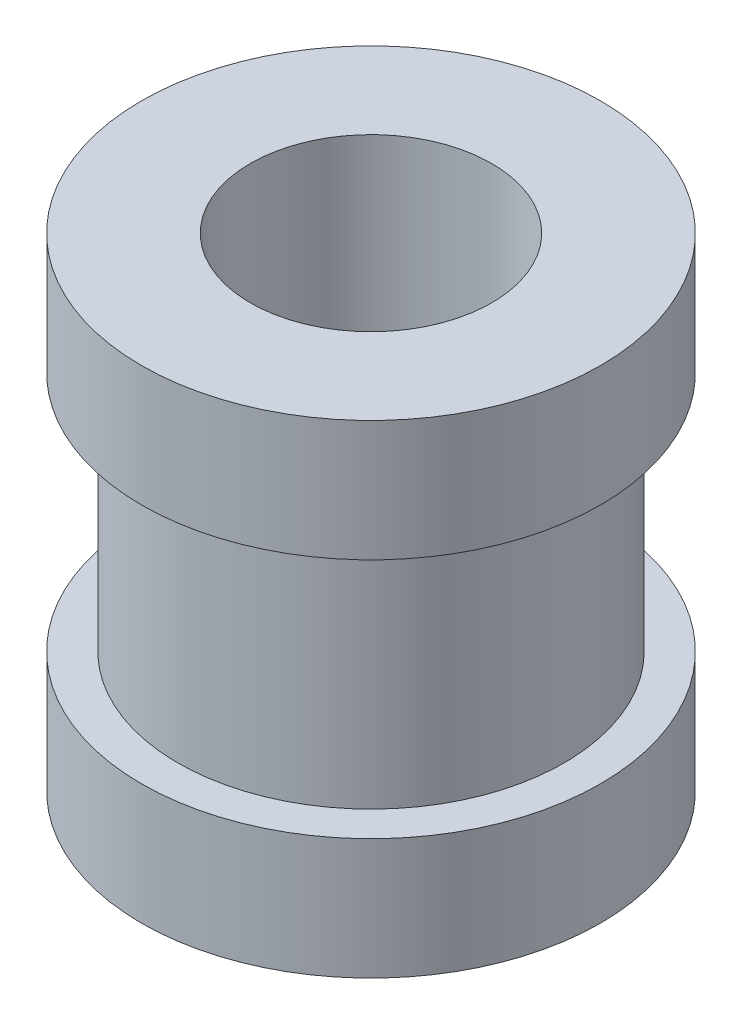
ISO-10303-21;
HEADER;
FILE_DESCRIPTION(('STEP AP214'),'2;1');
FILE_NAME('part.step','',(''),(''),'','','');
FILE_SCHEMA(('AUTOMOTIVE_DESIGN { 1 0 10303 214 1 1 1 1 }'));
ENDSEC;
DATA;
#1=APPLICATION_CONTEXT('core data for automotive mechanical design processes');
#2=APPLICATION_PROTOCOL_DEFINITION('international standard','automotive_design',2000,#1);
#3=PRODUCT_CONTEXT('',#1,'mechanical');
#4=PRODUCT('Part','Part','',(#3));
#5=PRODUCT_RELATED_PRODUCT_CATEGORY('part','',(#4));
#6=PRODUCT_DEFINITION_FORMATION('','',#4);
#7=PRODUCT_DEFINITION_CONTEXT('part definition',#1,'design');
#8=PRODUCT_DEFINITION('design','',#6,#7);
#9=PRODUCT_DEFINITION_SHAPE('','',#8);
#10=(LENGTH_UNIT() NAMED_UNIT(*) SI_UNIT(.MILLI.,.METRE.));
#11=(NAMED_UNIT(*) PLANE_ANGLE_UNIT() SI_UNIT($,.RADIAN.));
#12=(NAMED_UNIT(*) SI_UNIT($,.STERADIAN.) SOLID_ANGLE_UNIT());
#13=UNCERTAINTY_MEASURE_WITH_UNIT(LENGTH_MEASURE(1.E-05),#10,'distance_accuracy_value','');
#14=(GEOMETRIC_REPRESENTATION_CONTEXT(3) GLOBAL_UNCERTAINTY_ASSIGNED_CONTEXT((#13)) GLOBAL_UNIT_ASSIGNED_CONTEXT((#10,
#11,#12)) REPRESENTATION_CONTEXT('',''));
#15=CARTESIAN_POINT('',(0.,0.,0.));
#16=DIRECTION('',(0.,0.,1.));
#17=DIRECTION('',(1.,0.,0.));
#18=AXIS2_PLACEMENT_3D('',#15,#16,#17);
#19=CARTESIAN_POINT('',(21.2956759474531,70.9670130886636,143.228955153829));
#20=DIRECTION('',(0.,1.,0.));
#21=DIRECTION('',(-1.,0.,0.));
#22=AXIS2_PLACEMENT_3D('',#19,#20,#21);
#23=CYLINDRICAL_SURFACE('',#22,1.6);
#24=CARTESIAN_POINT('',(21.2956759474531,71.9670130886636,143.228955153829));
#25=DIRECTION('',(0.,1.,0.));
#26=DIRECTION('',(-1.,0.,0.));
#27=AXIS2_PLACEMENT_3D('',#24,#25,#26);
#28=CIRCLE('',#27,1.6);
#29=CARTESIAN_POINT('',(19.6956759474531,71.9670130886636,143.228955153829));
#30=VERTEX_POINT('',#29);
#31=EDGE_CURVE('E18',#30,#30,#28,.T.);
#32=ORIENTED_EDGE('',*,*,#31,.F.);
#33=EDGE_LOOP('',(#32));
#34=FACE_BOUND('',#33,.T.);
#35=CARTESIAN_POINT('',(21.2956759474531,69.9670130886636,143.228955153829));
#36=DIRECTION('',(0.,1.,0.));
#37=DIRECTION('',(-1.,0.,0.));
#38=AXIS2_PLACEMENT_3D('',#35,#36,#37);
#39=CIRCLE('',#38,1.6);
#40=CARTESIAN_POINT('',(19.6956759474531,69.9670130886636,143.228955153829));
#41=VERTEX_POINT('',#40);
#42=EDGE_CURVE('E40',#41,#41,#39,.F.);
#43=ORIENTED_EDGE('',*,*,#42,.F.);
#44=EDGE_LOOP('',(#43));
#45=FACE_BOUND('',#44,.T.);
#46=ADVANCED_FACE('F15',(#34,#45),#23,.T.);
#47=CARTESIAN_POINT('',(23.4956759474531,71.9670130886636,143.228955153829));
#48=DIRECTION('',(0.,-1.,0.));
#49=DIRECTION('',(1.,0.,0.));
#50=AXIS2_PLACEMENT_3D('',#47,#48,#49);
#51=PLANE('',#50);
#52=ORIENTED_EDGE('',*,*,#31,.T.);
#53=EDGE_LOOP('',(#52));
#54=FACE_BOUND('',#53,.T.);
#55=CARTESIAN_POINT('',(21.2956759474531,71.9670130886636,143.228955153829));
#56=DIRECTION('',(0.,1.,0.));
#57=DIRECTION('',(-1.,0.,0.));
#58=AXIS2_PLACEMENT_3D('',#55,#56,#57);
#59=CIRCLE('',#58,1.90000000000001);
#60=CARTESIAN_POINT('',(19.3956759474531,71.9670130886636,143.228955153829));
#61=VERTEX_POINT('',#60);
#62=EDGE_CURVE('E38',#61,#61,#59,.T.);
#63=ORIENTED_EDGE('',*,*,#62,.F.);
#64=EDGE_LOOP('',(#63));
#65=FACE_BOUND('',#64,.T.);
#66=ADVANCED_FACE('F47',(#54,#65),#51,.T.);
#67=CARTESIAN_POINT('',(23.4956759474531,69.9670130886636,143.228955153829));
#68=DIRECTION('',(0.,1.,0.));
#69=DIRECTION('',(-1.,0.,0.));
#70=AXIS2_PLACEMENT_3D('',#67,#68,#69);
#71=PLANE('',#70);
#72=ORIENTED_EDGE('',*,*,#42,.T.);
#73=EDGE_LOOP('',(#72));
#74=FACE_BOUND('',#73,.T.);
#75=CARTESIAN_POINT('',(21.2956759474531,69.9670130886636,143.228955153829));
#76=DIRECTION('',(0.,1.,0.));
#77=DIRECTION('',(-1.,0.,0.));
#78=AXIS2_PLACEMENT_3D('',#75,#76,#77);
#79=CIRCLE('',#78,1.90000000000001);
#80=CARTESIAN_POINT('',(19.3956759474531,69.9670130886636,143.228955153829));
#81=VERTEX_POINT('',#80);
#82=EDGE_CURVE('E35',#81,#81,#79,.F.);
#83=ORIENTED_EDGE('',*,*,#82,.F.);
#84=EDGE_LOOP('',(#83));
#85=FACE_BOUND('',#84,.T.);
#86=ADVANCED_FACE('F56',(#74,#85),#71,.T.);
#87=CARTESIAN_POINT('',(21.2956759474531,68.9670130886636,143.228955153829));
#88=DIRECTION('',(0.,1.,0.));
#89=DIRECTION('',(-1.,0.,0.));
#90=AXIS2_PLACEMENT_3D('',#87,#88,#89);
#91=CYLINDRICAL_SURFACE('',#90,1.90000000000001);
#92=ORIENTED_EDGE('',*,*,#62,.T.);
#93=EDGE_LOOP('',(#92));
#94=FACE_BOUND('',#93,.T.);
#95=CARTESIAN_POINT('',(21.2956759474531,72.9670130886636,143.228955153829));
#96=DIRECTION('',(0.,1.,0.));
#97=DIRECTION('',(-1.,0.,0.));
#98=AXIS2_PLACEMENT_3D('',#95,#96,#97);
#99=CIRCLE('',#98,1.90000000000001);
#100=CARTESIAN_POINT('',(19.3956759474531,72.9670130886636,143.228955153829));
#101=VERTEX_POINT('',#100);
#102=EDGE_CURVE('E32',#101,#101,#99,.F.);
#103=ORIENTED_EDGE('',*,*,#102,.T.);
#104=EDGE_LOOP('',(#103));
#105=FACE_BOUND('',#104,.T.);
#106=ADVANCED_FACE('F76',(#94,#105),#91,.T.);
#107=CARTESIAN_POINT('',(21.2956759474531,68.9670130886636,143.228955153829));
#108=DIRECTION('',(0.,1.,0.));
#109=DIRECTION('',(-1.,0.,0.));
#110=AXIS2_PLACEMENT_3D('',#107,#108,#109);
#111=CYLINDRICAL_SURFACE('',#110,1.90000000000001);
#112=ORIENTED_EDGE('',*,*,#82,.T.);
#113=EDGE_LOOP('',(#112));
#114=FACE_BOUND('',#113,.T.);
#115=CARTESIAN_POINT('',(21.2956759474531,68.9670130886636,143.228955153829));
#116=DIRECTION('',(0.,1.,0.));
#117=DIRECTION('',(-1.,0.,0.));
#118=AXIS2_PLACEMENT_3D('',#115,#116,#117);
#119=CIRCLE('',#118,1.90000000000001);
#120=CARTESIAN_POINT('',(19.3956759474531,68.9670130886636,143.228955153829));
#121=VERTEX_POINT('',#120);
#122=EDGE_CURVE('E27',#121,#121,#119,.F.);
#123=ORIENTED_EDGE('',*,*,#122,.F.);
#124=EDGE_LOOP('',(#123));
#125=FACE_BOUND('',#124,.T.);
#126=ADVANCED_FACE('F72',(#114,#125),#111,.T.);
#127=CARTESIAN_POINT('',(21.2956759474531,72.9670130886636,143.228955153829));
#128=DIRECTION('',(0.,-1.,0.));
#129=DIRECTION('',(1.,0.,0.));
#130=AXIS2_PLACEMENT_3D('',#127,#128,#129);
#131=PLANE('',#130);
#132=ORIENTED_EDGE('',*,*,#102,.F.);
#133=EDGE_LOOP('',(#132));
#134=FACE_BOUND('',#133,.T.);
#135=CARTESIAN_POINT('',(21.2956759474531,72.9670130886636,143.228955153829));
#136=DIRECTION('',(0.,1.,0.));
#137=DIRECTION('',(-1.,0.,0.));
#138=AXIS2_PLACEMENT_3D('',#135,#136,#137);
#139=CIRCLE('',#138,1.);
#140=CARTESIAN_POINT('',(20.2956759474531,72.9670130886636,143.228955153829));
#141=VERTEX_POINT('',#140);
#142=EDGE_CURVE('E22',#141,#141,#139,.F.);
#143=ORIENTED_EDGE('',*,*,#142,.T.);
#144=EDGE_LOOP('',(#143));
#145=FACE_BOUND('',#144,.T.);
#146=ADVANCED_FACE('F65',(#134,#145),#131,.F.);
#147=CARTESIAN_POINT('',(21.2956759474531,68.9670130886636,143.228955153829));
#148=DIRECTION('',(0.,-1.,0.));
#149=DIRECTION('',(1.,0.,0.));
#150=AXIS2_PLACEMENT_3D('',#147,#148,#149);
#151=PLANE('',#150);
#152=ORIENTED_EDGE('',*,*,#122,.T.);
#153=EDGE_LOOP('',(#152));
#154=FACE_BOUND('',#153,.T.);
#155=CARTESIAN_POINT('',(21.2956759474531,68.9670130886636,143.228955153829));
#156=DIRECTION('',(0.,1.,0.));
#157=DIRECTION('',(-1.,0.,0.));
#158=AXIS2_PLACEMENT_3D('',#155,#156,#157);
#159=CIRCLE('',#158,1.);
#160=CARTESIAN_POINT('',(20.2956759474531,68.9670130886636,143.228955153829));
#161=VERTEX_POINT('',#160);
#162=EDGE_CURVE('E10',#161,#161,#159,.T.);
#163=ORIENTED_EDGE('',*,*,#162,.T.);
#164=EDGE_LOOP('',(#163));
#165=FACE_BOUND('',#164,.T.);
#166=ADVANCED_FACE('F59',(#154,#165),#151,.T.);
#167=CARTESIAN_POINT('',(21.2956759474531,68.9670130886636,143.228955153829));
#168=DIRECTION('',(0.,1.,0.));
#169=DIRECTION('',(-1.,0.,0.));
#170=AXIS2_PLACEMENT_3D('',#167,#168,#169);
#171=CYLINDRICAL_SURFACE('',#170,1.);
#172=ORIENTED_EDGE('',*,*,#162,.F.);
#173=EDGE_LOOP('',(#172));
#174=FACE_BOUND('',#173,.T.);
#175=ORIENTED_EDGE('',*,*,#142,.F.);
#176=EDGE_LOOP('',(#175));
#177=FACE_BOUND('',#176,.T.);
#178=ADVANCED_FACE('F57',(#174,#177),#171,.F.);
#179=CLOSED_SHELL('',(#46,#66,#86,#106,#126,#146,#166,#178));
#180=MANIFOLD_SOLID_BREP('B1',#179);
#181=ADVANCED_BREP_SHAPE_REPRESENTATION('',(#18,#180),#14);
#182=SHAPE_DEFINITION_REPRESENTATION(#9,#181);
ENDSEC;
END-ISO-10303-21;
